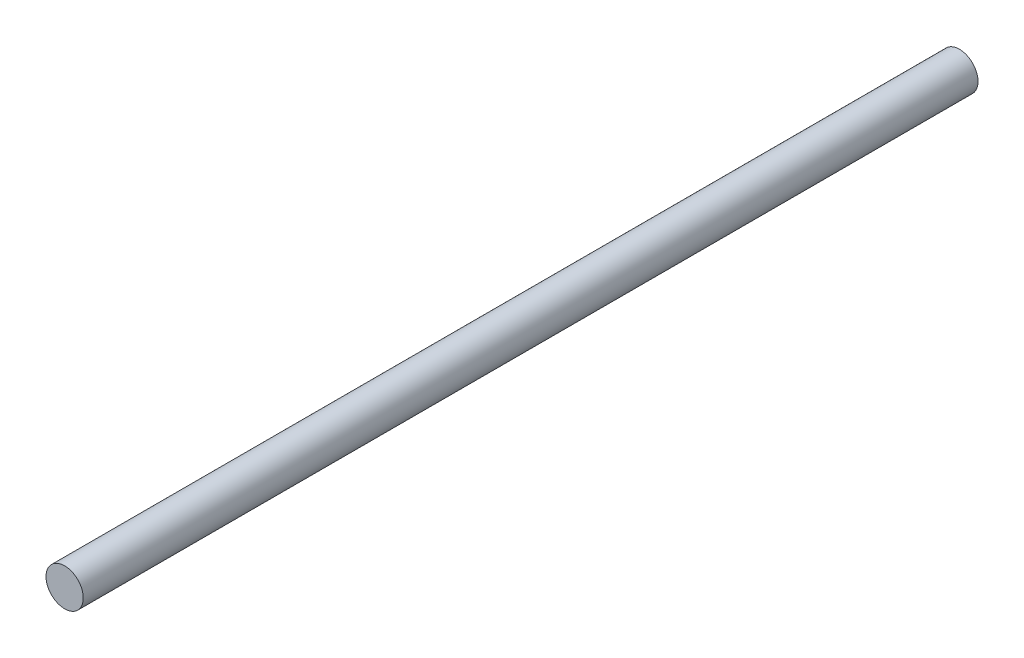
ISO-10303-21;
HEADER;
FILE_DESCRIPTION(('STEP AP214'),'2;1');
FILE_NAME('part.step','',(''),(''),'','','');
FILE_SCHEMA(('AUTOMOTIVE_DESIGN { 1 0 10303 214 1 1 1 1 }'));
ENDSEC;
DATA;
#1=APPLICATION_CONTEXT('core data for automotive mechanical design processes');
#2=APPLICATION_PROTOCOL_DEFINITION('international standard','automotive_design',2000,#1);
#3=PRODUCT_CONTEXT('',#1,'mechanical');
#4=PRODUCT('Part','Part','',(#3));
#5=PRODUCT_RELATED_PRODUCT_CATEGORY('part','',(#4));
#6=PRODUCT_DEFINITION_FORMATION('','',#4);
#7=PRODUCT_DEFINITION_CONTEXT('part definition',#1,'design');
#8=PRODUCT_DEFINITION('design','',#6,#7);
#9=PRODUCT_DEFINITION_SHAPE('','',#8);
#10=(LENGTH_UNIT() NAMED_UNIT(*) SI_UNIT(.MILLI.,.METRE.));
#11=(NAMED_UNIT(*) PLANE_ANGLE_UNIT() SI_UNIT($,.RADIAN.));
#12=(NAMED_UNIT(*) SI_UNIT($,.STERADIAN.) SOLID_ANGLE_UNIT());
#13=UNCERTAINTY_MEASURE_WITH_UNIT(LENGTH_MEASURE(1.E-05),#10,'distance_accuracy_value','');
#14=(GEOMETRIC_REPRESENTATION_CONTEXT(3) GLOBAL_UNCERTAINTY_ASSIGNED_CONTEXT((#13)) GLOBAL_UNIT_ASSIGNED_CONTEXT((#10,
#11,#12)) REPRESENTATION_CONTEXT('',''));
#15=CARTESIAN_POINT('',(0.,0.,0.));
#16=DIRECTION('',(0.,0.,1.));
#17=DIRECTION('',(1.,0.,0.));
#18=AXIS2_PLACEMENT_3D('',#15,#16,#17);
#19=CARTESIAN_POINT('',(0.,0.,76.2));
#20=DIRECTION('',(0.,0.,-1.));
#21=DIRECTION('',(-1.,0.,0.));
#22=AXIS2_PLACEMENT_3D('',#19,#20,#21);
#23=CYLINDRICAL_SURFACE('',#22,1.5875);
#24=CARTESIAN_POINT('',(0.,0.,76.2));
#25=DIRECTION('',(0.,0.,1.));
#26=DIRECTION('',(1.,0.,0.));
#27=AXIS2_PLACEMENT_3D('',#24,#25,#26);
#28=CIRCLE('',#27,1.5875);
#29=CARTESIAN_POINT('',(-1.5875,0.,76.2));
#30=VERTEX_POINT('',#29);
#31=EDGE_CURVE('E10',#30,#30,#28,.T.);
#32=CARTESIAN_POINT('',(0.,0.,0.));
#33=DIRECTION('',(0.,0.,1.));
#34=DIRECTION('',(1.,0.,0.));
#35=AXIS2_PLACEMENT_3D('',#32,#33,#34);
#36=CIRCLE('',#35,1.5875);
#37=CARTESIAN_POINT('',(-1.5875,0.,0.));
#38=VERTEX_POINT('',#37);
#39=EDGE_CURVE('E34',#38,#38,#36,.T.);
#40=CARTESIAN_POINT('',(-1.5875,0.,76.2));
#41=CARTESIAN_POINT('',(-1.5875,0.,75.40625));
#42=CARTESIAN_POINT('',(-1.5875,0.,74.6125));
#43=CARTESIAN_POINT('',(-1.5875,0.,73.025));
#44=CARTESIAN_POINT('',(-1.5875,0.,72.23125));
#45=CARTESIAN_POINT('',(-1.5875,0.,70.64375));
#46=CARTESIAN_POINT('',(-1.5875,0.,69.85));
#47=CARTESIAN_POINT('',(-1.5875,0.,68.2625));
#48=CARTESIAN_POINT('',(-1.5875,0.,67.46875));
#49=CARTESIAN_POINT('',(-1.5875,0.,65.88125));
#50=CARTESIAN_POINT('',(-1.5875,0.,65.0875));
#51=CARTESIAN_POINT('',(-1.5875,0.,63.5));
#52=CARTESIAN_POINT('',(-1.5875,0.,62.70625));
#53=CARTESIAN_POINT('',(-1.5875,0.,61.11875));
#54=CARTESIAN_POINT('',(-1.5875,0.,60.325));
#55=CARTESIAN_POINT('',(-1.5875,0.,58.7375));
#56=CARTESIAN_POINT('',(-1.5875,0.,57.94375));
#57=CARTESIAN_POINT('',(-1.5875,0.,56.35625));
#58=CARTESIAN_POINT('',(-1.5875,0.,55.5625));
#59=CARTESIAN_POINT('',(-1.5875,0.,53.975));
#60=CARTESIAN_POINT('',(-1.5875,0.,53.18125));
#61=CARTESIAN_POINT('',(-1.5875,0.,51.59375));
#62=CARTESIAN_POINT('',(-1.5875,0.,50.8));
#63=CARTESIAN_POINT('',(-1.5875,0.,49.2125));
#64=CARTESIAN_POINT('',(-1.5875,0.,48.41875));
#65=CARTESIAN_POINT('',(-1.5875,0.,46.83125));
#66=CARTESIAN_POINT('',(-1.5875,0.,46.0375));
#67=CARTESIAN_POINT('',(-1.5875,0.,44.45));
#68=CARTESIAN_POINT('',(-1.5875,0.,43.65625));
#69=CARTESIAN_POINT('',(-1.5875,0.,42.06875));
#70=CARTESIAN_POINT('',(-1.5875,0.,41.275));
#71=CARTESIAN_POINT('',(-1.5875,0.,39.6875));
#72=CARTESIAN_POINT('',(-1.5875,0.,38.89375));
#73=CARTESIAN_POINT('',(-1.5875,0.,37.30625));
#74=CARTESIAN_POINT('',(-1.5875,0.,36.5125));
#75=CARTESIAN_POINT('',(-1.5875,0.,34.925));
#76=CARTESIAN_POINT('',(-1.5875,0.,34.13125));
#77=CARTESIAN_POINT('',(-1.5875,0.,32.54375));
#78=CARTESIAN_POINT('',(-1.5875,0.,31.75));
#79=CARTESIAN_POINT('',(-1.5875,0.,30.1625));
#80=CARTESIAN_POINT('',(-1.5875,0.,29.36875));
#81=CARTESIAN_POINT('',(-1.5875,0.,27.78125));
#82=CARTESIAN_POINT('',(-1.5875,0.,26.9875));
#83=CARTESIAN_POINT('',(-1.5875,0.,25.4));
#84=CARTESIAN_POINT('',(-1.5875,0.,24.60625));
#85=CARTESIAN_POINT('',(-1.5875,0.,23.01875));
#86=CARTESIAN_POINT('',(-1.5875,0.,22.225));
#87=CARTESIAN_POINT('',(-1.5875,0.,20.6375));
#88=CARTESIAN_POINT('',(-1.5875,0.,19.84375));
#89=CARTESIAN_POINT('',(-1.5875,0.,18.25625));
#90=CARTESIAN_POINT('',(-1.5875,0.,17.4625));
#91=CARTESIAN_POINT('',(-1.5875,0.,15.875));
#92=CARTESIAN_POINT('',(-1.5875,0.,15.08125));
#93=CARTESIAN_POINT('',(-1.5875,0.,13.49375));
#94=CARTESIAN_POINT('',(-1.5875,0.,12.7));
#95=CARTESIAN_POINT('',(-1.5875,0.,11.1125));
#96=CARTESIAN_POINT('',(-1.5875,0.,10.31875));
#97=CARTESIAN_POINT('',(-1.5875,0.,8.73125));
#98=CARTESIAN_POINT('',(-1.5875,0.,7.93750000000001));
#99=CARTESIAN_POINT('',(-1.5875,0.,6.35));
#100=CARTESIAN_POINT('',(-1.5875,0.,5.55625));
#101=CARTESIAN_POINT('',(-1.5875,0.,3.96875));
#102=CARTESIAN_POINT('',(-1.5875,0.,3.175));
#103=CARTESIAN_POINT('',(-1.5875,0.,1.5875));
#104=CARTESIAN_POINT('',(-1.5875,0.,0.793750000000001));
#105=CARTESIAN_POINT('',(-1.5875,0.,0.));
#106=B_SPLINE_CURVE_WITH_KNOTS('',3,(#40,#41,#42,#43,#44,#45,#46,#47,#48,#49,#50,#51,#52,#53,
#54,#55,#56,#57,#58,#59,#60,#61,#62,#63,#64,#65,#66,#67,#68,#69,#70,#71,#72,#73,#74,#75,#76,#77,
#78,#79,#80,#81,#82,#83,#84,#85,#86,#87,#88,#89,#90,#91,#92,#93,#94,#95,#96,#97,#98,#99,#100,
#101,#102,#103,#104,#105),.UNSPECIFIED.,.F.,.F.,(4,2,2,2,2,2,2,2,2,2,2,2,2,2,2,2,2,2,2,2,2,2,2,
2,2,2,2,2,2,2,2,2,4),(0.,2.38125,4.7625,7.14375,9.52500000000001,11.90625,14.2875,16.66875,
19.05,21.43125,23.8125,26.19375,28.575,30.95625,33.3375,35.71875,38.1,40.48125,42.8625,45.24375,
47.625,50.00625,52.3875,54.76875,57.15,59.53125,61.9125,64.29375,66.675,69.05625,71.4375,
73.81875,76.2),.UNSPECIFIED.);
#107=EDGE_CURVE('BSEAM31',#30,#38,#106,.T.);
#108=ORIENTED_EDGE('',*,*,#31,.F.);
#109=ORIENTED_EDGE('',*,*,#39,.T.);
#110=ORIENTED_EDGE('',*,*,#107,.T.);
#111=ORIENTED_EDGE('',*,*,#107,.F.);
#112=EDGE_LOOP('',(#108,#110,#109,#111));
#113=FACE_BOUND('',#112,.T.);
#114=ADVANCED_FACE('F31',(#113),#23,.T.);
#115=CARTESIAN_POINT('',(0.,0.,76.2));
#116=DIRECTION('',(0.,0.,1.));
#117=DIRECTION('',(1.,0.,0.));
#118=AXIS2_PLACEMENT_3D('',#115,#116,#117);
#119=PLANE('',#118);
#120=ORIENTED_EDGE('',*,*,#31,.T.);
#121=EDGE_LOOP('',(#120));
#122=FACE_BOUND('',#121,.T.);
#123=ADVANCED_FACE('F46',(#122),#119,.T.);
#124=CARTESIAN_POINT('',(0.,0.,0.));
#125=DIRECTION('',(0.,0.,1.));
#126=DIRECTION('',(1.,0.,0.));
#127=AXIS2_PLACEMENT_3D('',#124,#125,#126);
#128=PLANE('',#127);
#129=ORIENTED_EDGE('',*,*,#39,.F.);
#130=EDGE_LOOP('',(#129));
#131=FACE_BOUND('',#130,.T.);
#132=ADVANCED_FACE('F44',(#131),#128,.F.);
#133=CLOSED_SHELL('',(#114,#123,#132));
#134=MANIFOLD_SOLID_BREP('B2',#133);
#135=ADVANCED_BREP_SHAPE_REPRESENTATION('',(#18,#134),#14);
#136=SHAPE_DEFINITION_REPRESENTATION(#9,#135);
ENDSEC;
END-ISO-10303-21;
